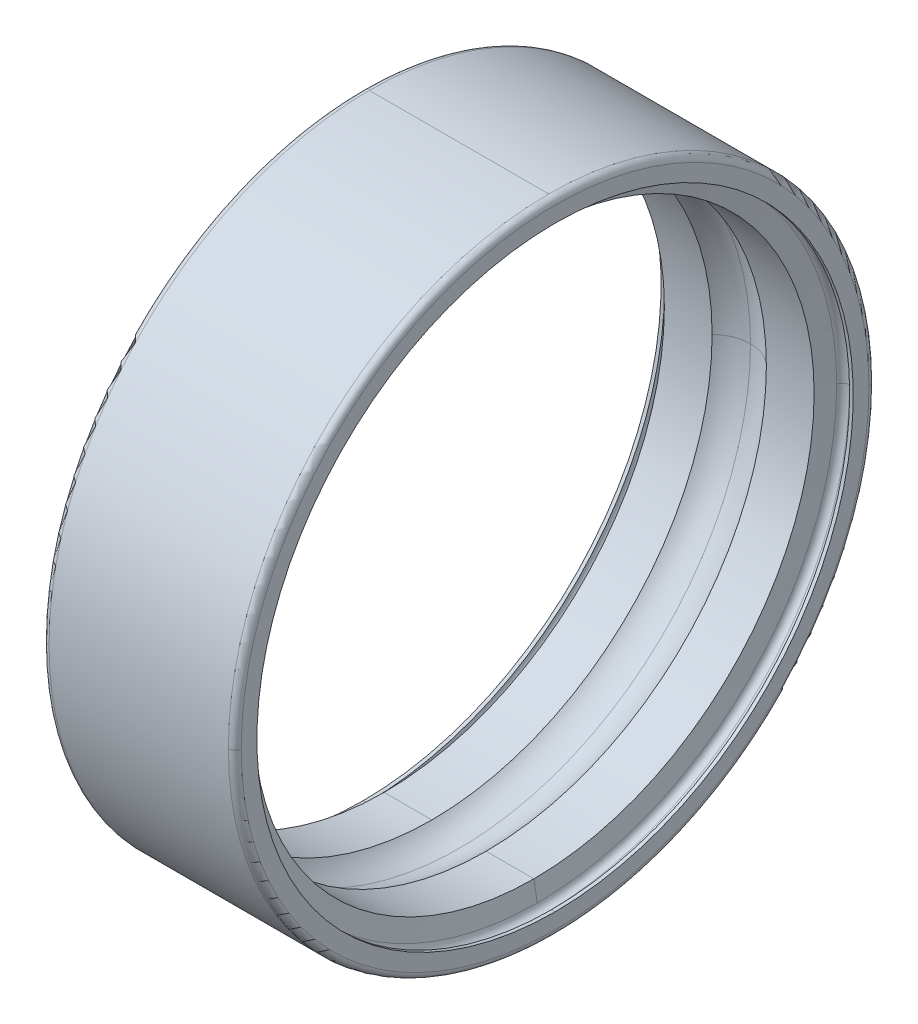
ISO-10303-21;
HEADER;
FILE_DESCRIPTION(('STEP AP214'),'2;1');
FILE_NAME('part.step','',(''),(''),'','','');
FILE_SCHEMA(('AUTOMOTIVE_DESIGN { 1 0 10303 214 1 1 1 1 }'));
ENDSEC;
DATA;
#1=APPLICATION_CONTEXT('core data for automotive mechanical design processes');
#2=APPLICATION_PROTOCOL_DEFINITION('international standard','automotive_design',2000,#1);
#3=PRODUCT_CONTEXT('',#1,'mechanical');
#4=PRODUCT('Part','Part','',(#3));
#5=PRODUCT_RELATED_PRODUCT_CATEGORY('part','',(#4));
#6=PRODUCT_DEFINITION_FORMATION('','',#4);
#7=PRODUCT_DEFINITION_CONTEXT('part definition',#1,'design');
#8=PRODUCT_DEFINITION('design','',#6,#7);
#9=PRODUCT_DEFINITION_SHAPE('','',#8);
#10=(LENGTH_UNIT() NAMED_UNIT(*) SI_UNIT(.MILLI.,.METRE.));
#11=(NAMED_UNIT(*) PLANE_ANGLE_UNIT() SI_UNIT($,.RADIAN.));
#12=(NAMED_UNIT(*) SI_UNIT($,.STERADIAN.) SOLID_ANGLE_UNIT());
#13=UNCERTAINTY_MEASURE_WITH_UNIT(LENGTH_MEASURE(1.E-05),#10,'distance_accuracy_value','');
#14=(GEOMETRIC_REPRESENTATION_CONTEXT(3) GLOBAL_UNCERTAINTY_ASSIGNED_CONTEXT((#13)) GLOBAL_UNIT_ASSIGNED_CONTEXT((#10,
#11,#12)) REPRESENTATION_CONTEXT('',''));
#15=CARTESIAN_POINT('',(0.,0.,0.));
#16=DIRECTION('',(0.,0.,1.));
#17=DIRECTION('',(1.,0.,0.));
#18=AXIS2_PLACEMENT_3D('',#15,#16,#17);
#19=CARTESIAN_POINT('',(2.832,0.,0.));
#20=DIRECTION('',(1.,0.,0.));
#21=DIRECTION('',(0.,0.,-1.));
#22=AXIS2_PLACEMENT_3D('',#19,#20,#21);
#23=TOROIDAL_SURFACE('',#22,4.655,0.112);
#24=CARTESIAN_POINT('',(2.832,0.,0.));
#25=DIRECTION('',(1.,0.,0.));
#26=DIRECTION('',(0.,0.,1.));
#27=AXIS2_PLACEMENT_3D('',#24,#25,#26);
#28=CIRCLE('',#27,4.767);
#29=CARTESIAN_POINT('',(2.832,0.,-4.767));
#30=VERTEX_POINT('',#29);
#31=CARTESIAN_POINT('',(2.832,0.,4.767));
#32=VERTEX_POINT('',#31);
#33=EDGE_CURVE('E392',#30,#32,#28,.T.);
#34=ORIENTED_EDGE('',*,*,#33,.T.);
#35=CARTESIAN_POINT('',(2.832,0.,4.655));
#36=DIRECTION('',(0.,-1.,0.));
#37=DIRECTION('',(0.,0.,1.));
#38=AXIS2_PLACEMENT_3D('',#35,#36,#37);
#39=CIRCLE('',#38,0.112);
#40=CARTESIAN_POINT('',(2.72170153166263,0.,4.6744485958987));
#41=VERTEX_POINT('',#40);
#42=EDGE_CURVE('E284',#32,#41,#39,.T.);
#43=ORIENTED_EDGE('',*,*,#42,.T.);
#44=CARTESIAN_POINT('',(2.72170153166263,0.,0.));
#45=DIRECTION('',(1.,0.,0.));
#46=DIRECTION('',(0.,1.,0.));
#47=AXIS2_PLACEMENT_3D('',#44,#45,#46);
#48=CIRCLE('',#47,4.6744485958987);
#49=CARTESIAN_POINT('',(2.72170153166263,4.6744485958987,0.));
#50=VERTEX_POINT('',#49);
#51=EDGE_CURVE('E31',#50,#41,#48,.T.);
#52=ORIENTED_EDGE('',*,*,#51,.F.);
#53=CARTESIAN_POINT('',(2.72170153166263,0.,0.));
#54=DIRECTION('',(1.,0.,0.));
#55=DIRECTION('',(0.,1.,0.));
#56=AXIS2_PLACEMENT_3D('',#53,#54,#55);
#57=CIRCLE('',#56,4.6744485958987);
#58=CARTESIAN_POINT('',(2.72170153166263,0.,-4.6744485958987));
#59=VERTEX_POINT('',#58);
#60=EDGE_CURVE('E221',#59,#50,#57,.T.);
#61=ORIENTED_EDGE('',*,*,#60,.F.);
#62=CARTESIAN_POINT('',(2.832,0.,-4.655));
#63=DIRECTION('',(0.,-1.,0.));
#64=DIRECTION('',(0.,0.,-1.));
#65=AXIS2_PLACEMENT_3D('',#62,#63,#64);
#66=CIRCLE('',#65,0.112);
#67=EDGE_CURVE('E274',#59,#30,#66,.T.);
#68=ORIENTED_EDGE('',*,*,#67,.T.);
#69=EDGE_LOOP('',(#34,#43,#52,#61,#68));
#70=FACE_BOUND('',#69,.T.);
#71=ADVANCED_FACE('F16',(#70),#23,.F.);
#72=CARTESIAN_POINT('',(2.972,0.,0.));
#73=DIRECTION('',(1.,0.,0.));
#74=DIRECTION('',(0.,1.,0.));
#75=AXIS2_PLACEMENT_3D('',#72,#73,#74);
#76=CYLINDRICAL_SURFACE('',#75,4.655);
#77=DIRECTION('',(1.,0.,0.));
#78=VECTOR('',#77,1.);
#79=CARTESIAN_POINT('',(2.972,4.655,0.));
#80=LINE('',#79,#78);
#81=CARTESIAN_POINT('',(2.944,4.655,0.));
#82=VERTEX_POINT('',#81);
#83=CARTESIAN_POINT('',(3.,4.655,0.));
#84=VERTEX_POINT('',#83);
#85=EDGE_CURVE('E286',#82,#84,#80,.T.);
#86=ORIENTED_EDGE('',*,*,#85,.T.);
#87=CARTESIAN_POINT('',(3.,0.,0.));
#88=DIRECTION('',(1.,0.,0.));
#89=DIRECTION('',(0.,1.,0.));
#90=AXIS2_PLACEMENT_3D('',#87,#88,#89);
#91=CIRCLE('',#90,4.655);
#92=CARTESIAN_POINT('',(3.,-4.655,0.));
#93=VERTEX_POINT('',#92);
#94=EDGE_CURVE('E11',#84,#93,#91,.T.);
#95=ORIENTED_EDGE('',*,*,#94,.T.);
#96=DIRECTION('',(-1.,0.,0.));
#97=VECTOR('',#96,1.);
#98=CARTESIAN_POINT('',(2.972,-4.655,0.));
#99=LINE('',#98,#97);
#100=CARTESIAN_POINT('',(2.944,-4.655,0.));
#101=VERTEX_POINT('',#100);
#102=EDGE_CURVE('E294',#93,#101,#99,.T.);
#103=ORIENTED_EDGE('',*,*,#102,.T.);
#104=CARTESIAN_POINT('',(2.944,0.,0.));
#105=DIRECTION('',(1.,0.,0.));
#106=DIRECTION('',(0.,1.,0.));
#107=AXIS2_PLACEMENT_3D('',#104,#105,#106);
#108=CIRCLE('',#107,4.655);
#109=CARTESIAN_POINT('',(2.944,0.,4.655));
#110=VERTEX_POINT('',#109);
#111=EDGE_CURVE('E263',#110,#101,#108,.T.);
#112=ORIENTED_EDGE('',*,*,#111,.F.);
#113=CARTESIAN_POINT('',(2.944,0.,0.));
#114=DIRECTION('',(1.,0.,0.));
#115=DIRECTION('',(0.,1.,0.));
#116=AXIS2_PLACEMENT_3D('',#113,#114,#115);
#117=CIRCLE('',#116,4.655);
#118=EDGE_CURVE('E401',#82,#110,#117,.T.);
#119=ORIENTED_EDGE('',*,*,#118,.F.);
#120=EDGE_LOOP('',(#86,#95,#103,#112,#119));
#121=FACE_BOUND('',#120,.T.);
#122=ADVANCED_FACE('F429',(#121),#76,.F.);
#123=CARTESIAN_POINT('',(3.,4.7775,0.));
#124=DIRECTION('',(1.,0.,0.));
#125=DIRECTION('',(0.,1.,0.));
#126=AXIS2_PLACEMENT_3D('',#123,#124,#125);
#127=PLANE('',#126);
#128=ORIENTED_EDGE('',*,*,#94,.F.);
#129=CARTESIAN_POINT('',(3.,0.,0.));
#130=DIRECTION('',(1.,0.,0.));
#131=DIRECTION('',(0.,1.,0.));
#132=AXIS2_PLACEMENT_3D('',#129,#130,#131);
#133=CIRCLE('',#132,4.655);
#134=EDGE_CURVE('E299',#93,#84,#133,.T.);
#135=ORIENTED_EDGE('',*,*,#134,.F.);
#136=EDGE_LOOP('',(#128,#135));
#137=FACE_BOUND('',#136,.T.);
#138=CARTESIAN_POINT('',(3.,0.,0.));
#139=DIRECTION('',(1.,0.,0.));
#140=DIRECTION('',(0.,1.,0.));
#141=AXIS2_PLACEMENT_3D('',#138,#139,#140);
#142=CIRCLE('',#141,4.9);
#143=CARTESIAN_POINT('',(3.,0.,4.9));
#144=VERTEX_POINT('',#143);
#145=CARTESIAN_POINT('',(3.,0.,-4.9));
#146=VERTEX_POINT('',#145);
#147=EDGE_CURVE('E19',#144,#146,#142,.T.);
#148=ORIENTED_EDGE('',*,*,#147,.T.);
#149=CARTESIAN_POINT('',(3.,0.,0.));
#150=DIRECTION('',(1.,0.,0.));
#151=DIRECTION('',(0.,1.,0.));
#152=AXIS2_PLACEMENT_3D('',#149,#150,#151);
#153=CIRCLE('',#152,4.9);
#154=EDGE_CURVE('E314',#146,#144,#153,.T.);
#155=ORIENTED_EDGE('',*,*,#154,.T.);
#156=EDGE_LOOP('',(#148,#155));
#157=FACE_BOUND('',#156,.T.);
#158=ADVANCED_FACE('F432',(#137,#157),#127,.T.);
#159=CARTESIAN_POINT('',(2.9,0.,0.));
#160=DIRECTION('',(1.,0.,0.));
#161=DIRECTION('',(0.,0.,-1.));
#162=AXIS2_PLACEMENT_3D('',#159,#160,#161);
#163=TOROIDAL_SURFACE('',#162,4.9,0.1);
#164=CARTESIAN_POINT('',(2.9,0.,-4.9));
#165=DIRECTION('',(0.,-1.,0.));
#166=DIRECTION('',(0.,0.,-1.));
#167=AXIS2_PLACEMENT_3D('',#164,#165,#166);
#168=CIRCLE('',#167,0.1);
#169=CARTESIAN_POINT('',(2.9,0.,-5.));
#170=VERTEX_POINT('',#169);
#171=EDGE_CURVE('E302',#170,#146,#168,.T.);
#172=ORIENTED_EDGE('',*,*,#171,.T.);
#173=ORIENTED_EDGE('',*,*,#147,.F.);
#174=CARTESIAN_POINT('',(2.9,0.,4.9));
#175=DIRECTION('',(0.,-1.,0.));
#176=DIRECTION('',(0.,0.,1.));
#177=AXIS2_PLACEMENT_3D('',#174,#175,#176);
#178=CIRCLE('',#177,0.1);
#179=CARTESIAN_POINT('',(2.9,0.,5.));
#180=VERTEX_POINT('',#179);
#181=EDGE_CURVE('E311',#144,#180,#178,.T.);
#182=ORIENTED_EDGE('',*,*,#181,.T.);
#183=CARTESIAN_POINT('',(2.9,0.,0.));
#184=DIRECTION('',(1.,0.,0.));
#185=DIRECTION('',(0.,1.,0.));
#186=AXIS2_PLACEMENT_3D('',#183,#184,#185);
#187=CIRCLE('',#186,5.);
#188=CARTESIAN_POINT('',(2.9,-5.,0.));
#189=VERTEX_POINT('',#188);
#190=EDGE_CURVE('E328',#180,#189,#187,.T.);
#191=ORIENTED_EDGE('',*,*,#190,.T.);
#192=CARTESIAN_POINT('',(2.9,0.,0.));
#193=DIRECTION('',(1.,0.,0.));
#194=DIRECTION('',(0.,1.,0.));
#195=AXIS2_PLACEMENT_3D('',#192,#193,#194);
#196=CIRCLE('',#195,5.);
#197=EDGE_CURVE('E244',#189,#170,#196,.T.);
#198=ORIENTED_EDGE('',*,*,#197,.T.);
#199=EDGE_LOOP('',(#172,#173,#182,#191,#198));
#200=FACE_BOUND('',#199,.T.);
#201=ADVANCED_FACE('F435',(#200),#163,.T.);
#202=CARTESIAN_POINT('',(1.5,0.,0.));
#203=DIRECTION('',(1.,0.,0.));
#204=DIRECTION('',(0.,1.,0.));
#205=AXIS2_PLACEMENT_3D('',#202,#203,#204);
#206=CYLINDRICAL_SURFACE('',#205,5.);
#207=DIRECTION('',(1.,0.,0.));
#208=VECTOR('',#207,1.);
#209=CARTESIAN_POINT('',(1.5,5.,0.));
#210=LINE('',#209,#208);
#211=CARTESIAN_POINT('',(0.1,5.,0.));
#212=VERTEX_POINT('',#211);
#213=CARTESIAN_POINT('',(2.9,5.,0.));
#214=VERTEX_POINT('',#213);
#215=EDGE_CURVE('E317',#212,#214,#210,.T.);
#216=ORIENTED_EDGE('',*,*,#215,.T.);
#217=CARTESIAN_POINT('',(2.9,0.,0.));
#218=DIRECTION('',(1.,0.,0.));
#219=DIRECTION('',(0.,1.,0.));
#220=AXIS2_PLACEMENT_3D('',#217,#218,#219);
#221=CIRCLE('',#220,5.);
#222=EDGE_CURVE('E305',#170,#214,#221,.T.);
#223=ORIENTED_EDGE('',*,*,#222,.F.);
#224=ORIENTED_EDGE('',*,*,#197,.F.);
#225=DIRECTION('',(-1.,0.,0.));
#226=VECTOR('',#225,1.);
#227=CARTESIAN_POINT('',(1.5,-5.,0.));
#228=LINE('',#227,#226);
#229=CARTESIAN_POINT('',(0.1,-5.,0.));
#230=VERTEX_POINT('',#229);
#231=EDGE_CURVE('E325',#189,#230,#228,.T.);
#232=ORIENTED_EDGE('',*,*,#231,.T.);
#233=CARTESIAN_POINT('',(0.1,0.,0.));
#234=DIRECTION('',(1.,0.,0.));
#235=DIRECTION('',(0.,1.,0.));
#236=AXIS2_PLACEMENT_3D('',#233,#234,#235);
#237=CIRCLE('',#236,5.);
#238=CARTESIAN_POINT('',(0.1,0.,-5.));
#239=VERTEX_POINT('',#238);
#240=EDGE_CURVE('E246',#230,#239,#237,.T.);
#241=ORIENTED_EDGE('',*,*,#240,.T.);
#242=CARTESIAN_POINT('',(0.1,0.,0.));
#243=DIRECTION('',(1.,0.,0.));
#244=DIRECTION('',(0.,1.,0.));
#245=AXIS2_PLACEMENT_3D('',#242,#243,#244);
#246=CIRCLE('',#245,5.);
#247=EDGE_CURVE('E338',#239,#212,#246,.T.);
#248=ORIENTED_EDGE('',*,*,#247,.T.);
#249=EDGE_LOOP('',(#216,#223,#224,#232,#241,#248));
#250=FACE_BOUND('',#249,.T.);
#251=ADVANCED_FACE('F445',(#250),#206,.T.);
#252=CARTESIAN_POINT('',(0.1,0.,0.));
#253=DIRECTION('',(1.,0.,0.));
#254=DIRECTION('',(0.,0.,-1.));
#255=AXIS2_PLACEMENT_3D('',#252,#253,#254);
#256=TOROIDAL_SURFACE('',#255,4.9,0.1);
#257=CARTESIAN_POINT('',(0.1,0.,-4.9));
#258=DIRECTION('',(0.,-1.,0.));
#259=DIRECTION('',(0.,0.,-1.));
#260=AXIS2_PLACEMENT_3D('',#257,#258,#259);
#261=CIRCLE('',#260,0.1);
#262=CARTESIAN_POINT('',(0.,0.,-4.9));
#263=VERTEX_POINT('',#262);
#264=EDGE_CURVE('E331',#263,#239,#261,.T.);
#265=ORIENTED_EDGE('',*,*,#264,.T.);
#266=ORIENTED_EDGE('',*,*,#240,.F.);
#267=CARTESIAN_POINT('',(0.1,0.,0.));
#268=DIRECTION('',(1.,0.,0.));
#269=DIRECTION('',(0.,1.,0.));
#270=AXIS2_PLACEMENT_3D('',#267,#268,#269);
#271=CIRCLE('',#270,5.);
#272=CARTESIAN_POINT('',(0.1,0.,5.));
#273=VERTEX_POINT('',#272);
#274=EDGE_CURVE('E322',#273,#230,#271,.T.);
#275=ORIENTED_EDGE('',*,*,#274,.F.);
#276=CARTESIAN_POINT('',(0.1,0.,4.9));
#277=DIRECTION('',(0.,-1.,0.));
#278=DIRECTION('',(0.,0.,1.));
#279=AXIS2_PLACEMENT_3D('',#276,#277,#278);
#280=CIRCLE('',#279,0.1);
#281=CARTESIAN_POINT('',(0.,0.,4.9));
#282=VERTEX_POINT('',#281);
#283=EDGE_CURVE('E335',#273,#282,#280,.T.);
#284=ORIENTED_EDGE('',*,*,#283,.T.);
#285=CARTESIAN_POINT('',(0.,0.,0.));
#286=DIRECTION('',(1.,0.,0.));
#287=DIRECTION('',(0.,1.,0.));
#288=AXIS2_PLACEMENT_3D('',#285,#286,#287);
#289=CIRCLE('',#288,4.9);
#290=EDGE_CURVE('E260',#282,#263,#289,.T.);
#291=ORIENTED_EDGE('',*,*,#290,.T.);
#292=EDGE_LOOP('',(#265,#266,#275,#284,#291));
#293=FACE_BOUND('',#292,.T.);
#294=ADVANCED_FACE('F381',(#293),#256,.T.);
#295=CARTESIAN_POINT('',(0.,4.7775,0.));
#296=DIRECTION('',(-1.,0.,0.));
#297=DIRECTION('',(0.,0.,1.));
#298=AXIS2_PLACEMENT_3D('',#295,#296,#297);
#299=PLANE('',#298);
#300=CARTESIAN_POINT('',(0.,0.,0.));
#301=DIRECTION('',(1.,0.,0.));
#302=DIRECTION('',(0.,1.,0.));
#303=AXIS2_PLACEMENT_3D('',#300,#301,#302);
#304=CIRCLE('',#303,4.655);
#305=CARTESIAN_POINT('',(0.,4.655,0.));
#306=VERTEX_POINT('',#305);
#307=CARTESIAN_POINT('',(0.,-4.655,0.));
#308=VERTEX_POINT('',#307);
#309=EDGE_CURVE('E377',#306,#308,#304,.T.);
#310=ORIENTED_EDGE('',*,*,#309,.T.);
#311=CARTESIAN_POINT('',(0.,0.,0.));
#312=DIRECTION('',(1.,0.,0.));
#313=DIRECTION('',(0.,1.,0.));
#314=AXIS2_PLACEMENT_3D('',#311,#312,#313);
#315=CIRCLE('',#314,4.655);
#316=EDGE_CURVE('E235',#308,#306,#315,.T.);
#317=ORIENTED_EDGE('',*,*,#316,.T.);
#318=EDGE_LOOP('',(#310,#317));
#319=FACE_BOUND('',#318,.T.);
#320=CARTESIAN_POINT('',(0.,0.,0.));
#321=DIRECTION('',(1.,0.,0.));
#322=DIRECTION('',(0.,1.,0.));
#323=AXIS2_PLACEMENT_3D('',#320,#321,#322);
#324=CIRCLE('',#323,4.9);
#325=EDGE_CURVE('E332',#263,#282,#324,.T.);
#326=ORIENTED_EDGE('',*,*,#325,.F.);
#327=ORIENTED_EDGE('',*,*,#290,.F.);
#328=EDGE_LOOP('',(#326,#327));
#329=FACE_BOUND('',#328,.T.);
#330=ADVANCED_FACE('F385',(#319,#329),#299,.T.);
#331=CARTESIAN_POINT('',(0.028,0.,0.));
#332=DIRECTION('',(1.,0.,0.));
#333=DIRECTION('',(0.,1.,0.));
#334=AXIS2_PLACEMENT_3D('',#331,#332,#333);
#335=CYLINDRICAL_SURFACE('',#334,4.655);
#336=DIRECTION('',(1.,0.,0.));
#337=VECTOR('',#336,1.);
#338=CARTESIAN_POINT('',(0.028,4.655,0.));
#339=LINE('',#338,#337);
#340=CARTESIAN_POINT('',(0.056,4.655,0.));
#341=VERTEX_POINT('',#340);
#342=EDGE_CURVE('E239',#306,#341,#339,.T.);
#343=ORIENTED_EDGE('',*,*,#342,.T.);
#344=CARTESIAN_POINT('',(0.056,0.,0.));
#345=DIRECTION('',(1.,0.,0.));
#346=DIRECTION('',(0.,1.,0.));
#347=AXIS2_PLACEMENT_3D('',#344,#345,#346);
#348=CIRCLE('',#347,4.655);
#349=CARTESIAN_POINT('',(0.056,0.,4.655));
#350=VERTEX_POINT('',#349);
#351=EDGE_CURVE('E375',#341,#350,#348,.T.);
#352=ORIENTED_EDGE('',*,*,#351,.T.);
#353=CARTESIAN_POINT('',(0.056,0.,0.));
#354=DIRECTION('',(1.,0.,0.));
#355=DIRECTION('',(0.,1.,0.));
#356=AXIS2_PLACEMENT_3D('',#353,#354,#355);
#357=CIRCLE('',#356,4.655);
#358=CARTESIAN_POINT('',(0.056,-4.655,0.));
#359=VERTEX_POINT('',#358);
#360=EDGE_CURVE('E267',#350,#359,#357,.T.);
#361=ORIENTED_EDGE('',*,*,#360,.T.);
#362=DIRECTION('',(-1.,0.,0.));
#363=VECTOR('',#362,1.);
#364=CARTESIAN_POINT('',(0.028,-4.655,0.));
#365=LINE('',#364,#363);
#366=EDGE_CURVE('E238',#359,#308,#365,.T.);
#367=ORIENTED_EDGE('',*,*,#366,.T.);
#368=ORIENTED_EDGE('',*,*,#309,.F.);
#369=EDGE_LOOP('',(#343,#352,#361,#367,#368));
#370=FACE_BOUND('',#369,.T.);
#371=ADVANCED_FACE('F537',(#370),#335,.F.);
#372=CARTESIAN_POINT('',(0.168,0.,0.));
#373=DIRECTION('',(1.,0.,0.));
#374=DIRECTION('',(0.,0.,-1.));
#375=AXIS2_PLACEMENT_3D('',#372,#373,#374);
#376=TOROIDAL_SURFACE('',#375,4.655,0.112);
#377=CARTESIAN_POINT('',(0.168,0.,0.));
#378=DIRECTION('',(1.,0.,0.));
#379=DIRECTION('',(0.,0.,1.));
#380=AXIS2_PLACEMENT_3D('',#377,#378,#379);
#381=CIRCLE('',#380,4.767);
#382=CARTESIAN_POINT('',(0.168,0.,-4.767));
#383=VERTEX_POINT('',#382);
#384=CARTESIAN_POINT('',(0.168,0.,4.767));
#385=VERTEX_POINT('',#384);
#386=EDGE_CURVE('E210',#383,#385,#381,.T.);
#387=ORIENTED_EDGE('',*,*,#386,.T.);
#388=CARTESIAN_POINT('',(0.168,0.,4.655));
#389=DIRECTION('',(0.,-1.,0.));
#390=DIRECTION('',(0.,0.,1.));
#391=AXIS2_PLACEMENT_3D('',#388,#389,#390);
#392=CIRCLE('',#391,0.112);
#393=EDGE_CURVE('E264',#385,#350,#392,.T.);
#394=ORIENTED_EDGE('',*,*,#393,.T.);
#395=ORIENTED_EDGE('',*,*,#351,.F.);
#396=CARTESIAN_POINT('',(0.056,0.,0.));
#397=DIRECTION('',(1.,0.,0.));
#398=DIRECTION('',(0.,1.,0.));
#399=AXIS2_PLACEMENT_3D('',#396,#397,#398);
#400=CIRCLE('',#399,4.655);
#401=CARTESIAN_POINT('',(0.056,0.,-4.655));
#402=VERTEX_POINT('',#401);
#403=EDGE_CURVE('E254',#402,#341,#400,.T.);
#404=ORIENTED_EDGE('',*,*,#403,.F.);
#405=CARTESIAN_POINT('',(0.168,0.,-4.655));
#406=DIRECTION('',(0.,-1.,0.));
#407=DIRECTION('',(0.,0.,-1.));
#408=AXIS2_PLACEMENT_3D('',#405,#406,#407);
#409=CIRCLE('',#408,0.112);
#410=EDGE_CURVE('E257',#402,#383,#409,.T.);
#411=ORIENTED_EDGE('',*,*,#410,.T.);
#412=EDGE_LOOP('',(#387,#394,#395,#404,#411));
#413=FACE_BOUND('',#412,.T.);
#414=ADVANCED_FACE('F533',(#413),#376,.F.);
#415=CARTESIAN_POINT('',(0.304698901733471,0.,0.));
#416=DIRECTION('',(-1.,0.,0.));
#417=DIRECTION('',(0.,1.,0.));
#418=AXIS2_PLACEMENT_3D('',#415,#416,#417);
#419=CONICAL_SURFACE('',#418,4.52472429794935,1.39626340159546);
#420=DIRECTION('',(0.173648177666931,-0.984807753012208,0.));
#421=VECTOR('',#420,1.);
#422=CARTESIAN_POINT('',(0.304698901733471,4.52472429794935,0.));
#423=LINE('',#422,#421);
#424=CARTESIAN_POINT('',(0.278298468337368,4.6744485958987,0.));
#425=VERTEX_POINT('',#424);
#426=CARTESIAN_POINT('',(0.331099335129574,4.375,0.));
#427=VERTEX_POINT('',#426);
#428=EDGE_CURVE('E201',#425,#427,#423,.T.);
#429=ORIENTED_EDGE('',*,*,#428,.T.);
#430=CARTESIAN_POINT('',(0.331099335129574,0.,0.));
#431=DIRECTION('',(1.,0.,0.));
#432=DIRECTION('',(0.,1.,0.));
#433=AXIS2_PLACEMENT_3D('',#430,#431,#432);
#434=CIRCLE('',#433,4.375);
#435=CARTESIAN_POINT('',(0.331099335129574,-4.375,0.));
#436=VERTEX_POINT('',#435);
#437=EDGE_CURVE('E373',#427,#436,#434,.T.);
#438=ORIENTED_EDGE('',*,*,#437,.T.);
#439=DIRECTION('',(-0.173648177666931,-0.984807753012208,0.));
#440=VECTOR('',#439,1.);
#441=CARTESIAN_POINT('',(0.304698901733471,-4.52472429794935,0.));
#442=LINE('',#441,#440);
#443=CARTESIAN_POINT('',(0.278298468337367,-4.6744485958987,0.));
#444=VERTEX_POINT('',#443);
#445=EDGE_CURVE('E271',#436,#444,#442,.T.);
#446=ORIENTED_EDGE('',*,*,#445,.T.);
#447=CARTESIAN_POINT('',(0.278298468337367,0.,0.));
#448=DIRECTION('',(1.,0.,0.));
#449=DIRECTION('',(0.,1.,0.));
#450=AXIS2_PLACEMENT_3D('',#447,#448,#449);
#451=CIRCLE('',#450,4.6744485958987);
#452=CARTESIAN_POINT('',(0.278298468337367,0.,4.6744485958987));
#453=VERTEX_POINT('',#452);
#454=EDGE_CURVE('E191',#453,#444,#451,.T.);
#455=ORIENTED_EDGE('',*,*,#454,.F.);
#456=CARTESIAN_POINT('',(0.278298468337367,0.,0.));
#457=DIRECTION('',(1.,0.,0.));
#458=DIRECTION('',(0.,1.,0.));
#459=AXIS2_PLACEMENT_3D('',#456,#457,#458);
#460=CIRCLE('',#459,4.6744485958987);
#461=EDGE_CURVE('E205',#425,#453,#460,.T.);
#462=ORIENTED_EDGE('',*,*,#461,.F.);
#463=EDGE_LOOP('',(#429,#438,#446,#455,#462));
#464=FACE_BOUND('',#463,.T.);
#465=ADVANCED_FACE('F529',(#464),#419,.F.);
#466=CARTESIAN_POINT('',(0.70378623823857,0.,0.));
#467=DIRECTION('',(1.,0.,0.));
#468=DIRECTION('',(0.,1.,0.));
#469=AXIS2_PLACEMENT_3D('',#466,#467,#468);
#470=CYLINDRICAL_SURFACE('',#469,4.375);
#471=DIRECTION('',(1.,0.,0.));
#472=VECTOR('',#471,1.);
#473=CARTESIAN_POINT('',(0.70378623823857,4.375,0.));
#474=LINE('',#473,#472);
#475=CARTESIAN_POINT('',(1.07647314134757,4.375,0.));
#476=VERTEX_POINT('',#475);
#477=EDGE_CURVE('E278',#427,#476,#474,.T.);
#478=ORIENTED_EDGE('',*,*,#477,.T.);
#479=CARTESIAN_POINT('',(1.07647314134757,0.,0.));
#480=DIRECTION('',(1.,0.,0.));
#481=DIRECTION('',(0.,1.,0.));
#482=AXIS2_PLACEMENT_3D('',#479,#480,#481);
#483=CIRCLE('',#482,4.375);
#484=CARTESIAN_POINT('',(1.07647314134757,0.,4.375));
#485=VERTEX_POINT('',#484);
#486=EDGE_CURVE('E371',#476,#485,#483,.T.);
#487=ORIENTED_EDGE('',*,*,#486,.T.);
#488=CARTESIAN_POINT('',(1.07647314134757,0.,0.));
#489=DIRECTION('',(1.,0.,0.));
#490=DIRECTION('',(0.,1.,0.));
#491=AXIS2_PLACEMENT_3D('',#488,#489,#490);
#492=CIRCLE('',#491,4.375);
#493=CARTESIAN_POINT('',(1.07647314134757,-4.375,0.));
#494=VERTEX_POINT('',#493);
#495=EDGE_CURVE('E354',#485,#494,#492,.T.);
#496=ORIENTED_EDGE('',*,*,#495,.T.);
#497=DIRECTION('',(-1.,0.,0.));
#498=VECTOR('',#497,1.);
#499=CARTESIAN_POINT('',(0.70378623823857,-4.375,0.));
#500=LINE('',#499,#498);
#501=EDGE_CURVE('E291',#494,#436,#500,.T.);
#502=ORIENTED_EDGE('',*,*,#501,.T.);
#503=ORIENTED_EDGE('',*,*,#437,.F.);
#504=EDGE_LOOP('',(#478,#487,#496,#502,#503));
#505=FACE_BOUND('',#504,.T.);
#506=ADVANCED_FACE('F525',(#505),#470,.F.);
#507=CARTESIAN_POINT('',(1.5,0.,0.));
#508=DIRECTION('',(1.,0.,0.));
#509=DIRECTION('',(0.,0.,-1.));
#510=AXIS2_PLACEMENT_3D('',#507,#508,#509);
#511=TOROIDAL_SURFACE('',#510,3.95,0.6);
#512=CARTESIAN_POINT('',(1.5,0.,0.));
#513=DIRECTION('',(1.,0.,0.));
#514=DIRECTION('',(0.,0.,1.));
#515=AXIS2_PLACEMENT_3D('',#512,#513,#514);
#516=CIRCLE('',#515,4.55);
#517=CARTESIAN_POINT('',(1.5,0.,-4.55));
#518=VERTEX_POINT('',#517);
#519=CARTESIAN_POINT('',(1.5,0.,4.55));
#520=VERTEX_POINT('',#519);
#521=EDGE_CURVE('E219',#518,#520,#516,.T.);
#522=ORIENTED_EDGE('',*,*,#521,.T.);
#523=CARTESIAN_POINT('',(1.5,0.,3.95));
#524=DIRECTION('',(0.,-1.,0.));
#525=DIRECTION('',(0.,0.,1.));
#526=AXIS2_PLACEMENT_3D('',#523,#524,#525);
#527=CIRCLE('',#526,0.6);
#528=EDGE_CURVE('E356',#520,#485,#527,.T.);
#529=ORIENTED_EDGE('',*,*,#528,.T.);
#530=ORIENTED_EDGE('',*,*,#486,.F.);
#531=CARTESIAN_POINT('',(1.07647314134757,0.,0.));
#532=DIRECTION('',(1.,0.,0.));
#533=DIRECTION('',(0.,1.,0.));
#534=AXIS2_PLACEMENT_3D('',#531,#532,#533);
#535=CIRCLE('',#534,4.375);
#536=CARTESIAN_POINT('',(1.07647314134757,0.,-4.375));
#537=VERTEX_POINT('',#536);
#538=EDGE_CURVE('E290',#537,#476,#535,.T.);
#539=ORIENTED_EDGE('',*,*,#538,.F.);
#540=CARTESIAN_POINT('',(1.5,0.,-3.95));
#541=DIRECTION('',(0.,-1.,0.));
#542=DIRECTION('',(0.,0.,-1.));
#543=AXIS2_PLACEMENT_3D('',#540,#541,#542);
#544=CIRCLE('',#543,0.6);
#545=EDGE_CURVE('E297',#537,#518,#544,.T.);
#546=ORIENTED_EDGE('',*,*,#545,.T.);
#547=EDGE_LOOP('',(#522,#529,#530,#539,#546));
#548=FACE_BOUND('',#547,.T.);
#549=ADVANCED_FACE('F522',(#548),#511,.F.);
#550=CARTESIAN_POINT('',(2.29621376176143,0.,0.));
#551=DIRECTION('',(1.,0.,0.));
#552=DIRECTION('',(0.,1.,0.));
#553=AXIS2_PLACEMENT_3D('',#550,#551,#552);
#554=CYLINDRICAL_SURFACE('',#553,4.375);
#555=DIRECTION('',(1.,0.,0.));
#556=VECTOR('',#555,1.);
#557=CARTESIAN_POINT('',(2.29621376176143,4.375,0.));
#558=LINE('',#557,#556);
#559=CARTESIAN_POINT('',(1.92352685865243,4.375,0.));
#560=VERTEX_POINT('',#559);
#561=CARTESIAN_POINT('',(2.66890066487043,4.375,0.));
#562=VERTEX_POINT('',#561);
#563=EDGE_CURVE('E359',#560,#562,#558,.T.);
#564=ORIENTED_EDGE('',*,*,#563,.T.);
#565=CARTESIAN_POINT('',(2.66890066487043,0.,0.));
#566=DIRECTION('',(1.,0.,0.));
#567=DIRECTION('',(0.,1.,0.));
#568=AXIS2_PLACEMENT_3D('',#565,#566,#567);
#569=CIRCLE('',#568,4.375);
#570=CARTESIAN_POINT('',(2.66890066487043,-4.375,0.));
#571=VERTEX_POINT('',#570);
#572=EDGE_CURVE('E39',#562,#571,#569,.T.);
#573=ORIENTED_EDGE('',*,*,#572,.T.);
#574=DIRECTION('',(-1.,0.,0.));
#575=VECTOR('',#574,1.);
#576=CARTESIAN_POINT('',(2.29621376176143,-4.375,0.));
#577=LINE('',#576,#575);
#578=CARTESIAN_POINT('',(1.92352685865244,-4.375,0.));
#579=VERTEX_POINT('',#578);
#580=EDGE_CURVE('E361',#571,#579,#577,.T.);
#581=ORIENTED_EDGE('',*,*,#580,.T.);
#582=CARTESIAN_POINT('',(1.92352685865243,0.,0.));
#583=DIRECTION('',(1.,0.,0.));
#584=DIRECTION('',(0.,1.,0.));
#585=AXIS2_PLACEMENT_3D('',#582,#583,#584);
#586=CIRCLE('',#585,4.375);
#587=CARTESIAN_POINT('',(1.92352685865243,0.,4.375));
#588=VERTEX_POINT('',#587);
#589=EDGE_CURVE('E240',#588,#579,#586,.T.);
#590=ORIENTED_EDGE('',*,*,#589,.F.);
#591=CARTESIAN_POINT('',(1.92352685865243,0.,0.));
#592=DIRECTION('',(1.,0.,0.));
#593=DIRECTION('',(0.,1.,0.));
#594=AXIS2_PLACEMENT_3D('',#591,#592,#593);
#595=CIRCLE('',#594,4.375);
#596=EDGE_CURVE('E228',#560,#588,#595,.T.);
#597=ORIENTED_EDGE('',*,*,#596,.F.);
#598=EDGE_LOOP('',(#564,#573,#581,#590,#597));
#599=FACE_BOUND('',#598,.T.);
#600=ADVANCED_FACE('F498',(#599),#554,.F.);
#601=CARTESIAN_POINT('',(2.69530109826653,0.,0.));
#602=DIRECTION('',(1.,0.,0.));
#603=DIRECTION('',(0.,1.,0.));
#604=AXIS2_PLACEMENT_3D('',#601,#602,#603);
#605=CONICAL_SURFACE('',#604,4.52472429794935,1.39626340159546);
#606=DIRECTION('',(0.17364817766693,0.984807753012208,0.));
#607=VECTOR('',#606,1.);
#608=CARTESIAN_POINT('',(2.69530109826653,4.52472429794935,0.));
#609=LINE('',#608,#607);
#610=EDGE_CURVE('E366',#562,#50,#609,.T.);
#611=ORIENTED_EDGE('',*,*,#610,.T.);
#612=ORIENTED_EDGE('',*,*,#51,.T.);
#613=CARTESIAN_POINT('',(2.72170153166263,0.,0.));
#614=DIRECTION('',(1.,0.,0.));
#615=DIRECTION('',(0.,1.,0.));
#616=AXIS2_PLACEMENT_3D('',#613,#614,#615);
#617=CIRCLE('',#616,4.6744485958987);
#618=CARTESIAN_POINT('',(2.72170153166263,-4.6744485958987,0.));
#619=VERTEX_POINT('',#618);
#620=EDGE_CURVE('E281',#41,#619,#617,.T.);
#621=ORIENTED_EDGE('',*,*,#620,.T.);
#622=DIRECTION('',(-0.17364817766693,0.984807753012208,0.));
#623=VECTOR('',#622,1.);
#624=CARTESIAN_POINT('',(2.69530109826653,-4.52472429794935,0.));
#625=LINE('',#624,#623);
#626=EDGE_CURVE('E346',#619,#571,#625,.T.);
#627=ORIENTED_EDGE('',*,*,#626,.T.);
#628=ORIENTED_EDGE('',*,*,#572,.F.);
#629=EDGE_LOOP('',(#611,#612,#621,#627,#628));
#630=FACE_BOUND('',#629,.T.);
#631=ADVANCED_FACE('F494',(#630),#605,.F.);
#632=CARTESIAN_POINT('',(2.69530109826653,0.,0.));
#633=DIRECTION('',(1.,0.,0.));
#634=DIRECTION('',(0.,1.,0.));
#635=AXIS2_PLACEMENT_3D('',#632,#633,#634);
#636=CONICAL_SURFACE('',#635,4.52472429794935,1.39626340159546);
#637=ORIENTED_EDGE('',*,*,#610,.F.);
#638=CARTESIAN_POINT('',(2.66890066487043,0.,0.));
#639=DIRECTION('',(1.,0.,0.));
#640=DIRECTION('',(0.,1.,0.));
#641=AXIS2_PLACEMENT_3D('',#638,#639,#640);
#642=CIRCLE('',#641,4.375);
#643=EDGE_CURVE('E363',#571,#562,#642,.T.);
#644=ORIENTED_EDGE('',*,*,#643,.F.);
#645=ORIENTED_EDGE('',*,*,#626,.F.);
#646=CARTESIAN_POINT('',(2.72170153166263,0.,0.));
#647=DIRECTION('',(1.,0.,0.));
#648=DIRECTION('',(0.,1.,0.));
#649=AXIS2_PLACEMENT_3D('',#646,#647,#648);
#650=CIRCLE('',#649,4.6744485958987);
#651=EDGE_CURVE('E275',#619,#59,#650,.T.);
#652=ORIENTED_EDGE('',*,*,#651,.T.);
#653=ORIENTED_EDGE('',*,*,#60,.T.);
#654=EDGE_LOOP('',(#637,#644,#645,#652,#653));
#655=FACE_BOUND('',#654,.T.);
#656=ADVANCED_FACE('F497',(#655),#636,.F.);
#657=CARTESIAN_POINT('',(2.29621376176143,0.,0.));
#658=DIRECTION('',(1.,0.,0.));
#659=DIRECTION('',(0.,1.,0.));
#660=AXIS2_PLACEMENT_3D('',#657,#658,#659);
#661=CYLINDRICAL_SURFACE('',#660,4.375);
#662=ORIENTED_EDGE('',*,*,#563,.F.);
#663=CARTESIAN_POINT('',(1.92352685865243,0.,0.));
#664=DIRECTION('',(1.,0.,0.));
#665=DIRECTION('',(0.,1.,0.));
#666=AXIS2_PLACEMENT_3D('',#663,#664,#665);
#667=CIRCLE('',#666,4.375);
#668=CARTESIAN_POINT('',(1.92352685865243,0.,-4.375));
#669=VERTEX_POINT('',#668);
#670=EDGE_CURVE('E225',#669,#560,#667,.T.);
#671=ORIENTED_EDGE('',*,*,#670,.F.);
#672=CARTESIAN_POINT('',(1.92352685865243,0.,0.));
#673=DIRECTION('',(1.,0.,0.));
#674=DIRECTION('',(0.,1.,0.));
#675=AXIS2_PLACEMENT_3D('',#672,#673,#674);
#676=CIRCLE('',#675,4.375);
#677=EDGE_CURVE('E243',#579,#669,#676,.T.);
#678=ORIENTED_EDGE('',*,*,#677,.F.);
#679=ORIENTED_EDGE('',*,*,#580,.F.);
#680=ORIENTED_EDGE('',*,*,#643,.T.);
#681=EDGE_LOOP('',(#662,#671,#678,#679,#680));
#682=FACE_BOUND('',#681,.T.);
#683=ADVANCED_FACE('F509',(#682),#661,.F.);
#684=CARTESIAN_POINT('',(1.5,0.,0.));
#685=DIRECTION('',(1.,0.,0.));
#686=DIRECTION('',(0.,0.,-1.));
#687=AXIS2_PLACEMENT_3D('',#684,#685,#686);
#688=TOROIDAL_SURFACE('',#687,3.95,0.6);
#689=CARTESIAN_POINT('',(1.5,0.,0.));
#690=DIRECTION('',(1.,0.,0.));
#691=DIRECTION('',(0.,0.,1.));
#692=AXIS2_PLACEMENT_3D('',#689,#690,#691);
#693=CIRCLE('',#692,4.55);
#694=EDGE_CURVE('E234',#520,#518,#693,.T.);
#695=ORIENTED_EDGE('',*,*,#694,.T.);
#696=ORIENTED_EDGE('',*,*,#545,.F.);
#697=CARTESIAN_POINT('',(1.07647314134757,0.,0.));
#698=DIRECTION('',(1.,0.,0.));
#699=DIRECTION('',(0.,1.,0.));
#700=AXIS2_PLACEMENT_3D('',#697,#698,#699);
#701=CIRCLE('',#700,4.375);
#702=EDGE_CURVE('E287',#494,#537,#701,.T.);
#703=ORIENTED_EDGE('',*,*,#702,.F.);
#704=ORIENTED_EDGE('',*,*,#495,.F.);
#705=ORIENTED_EDGE('',*,*,#528,.F.);
#706=EDGE_LOOP('',(#695,#696,#703,#704,#705));
#707=FACE_BOUND('',#706,.T.);
#708=ADVANCED_FACE('F504',(#707),#688,.F.);
#709=CARTESIAN_POINT('',(0.70378623823857,0.,0.));
#710=DIRECTION('',(1.,0.,0.));
#711=DIRECTION('',(0.,1.,0.));
#712=AXIS2_PLACEMENT_3D('',#709,#710,#711);
#713=CYLINDRICAL_SURFACE('',#712,4.375);
#714=ORIENTED_EDGE('',*,*,#477,.F.);
#715=CARTESIAN_POINT('',(0.331099335129574,0.,0.));
#716=DIRECTION('',(1.,0.,0.));
#717=DIRECTION('',(0.,1.,0.));
#718=AXIS2_PLACEMENT_3D('',#715,#716,#717);
#719=CIRCLE('',#718,4.375);
#720=EDGE_CURVE('E273',#436,#427,#719,.T.);
#721=ORIENTED_EDGE('',*,*,#720,.F.);
#722=ORIENTED_EDGE('',*,*,#501,.F.);
#723=ORIENTED_EDGE('',*,*,#702,.T.);
#724=ORIENTED_EDGE('',*,*,#538,.T.);
#725=EDGE_LOOP('',(#714,#721,#722,#723,#724));
#726=FACE_BOUND('',#725,.T.);
#727=ADVANCED_FACE('F482',(#726),#713,.F.);
#728=CARTESIAN_POINT('',(0.304698901733471,0.,0.));
#729=DIRECTION('',(-1.,0.,0.));
#730=DIRECTION('',(0.,1.,0.));
#731=AXIS2_PLACEMENT_3D('',#728,#729,#730);
#732=CONICAL_SURFACE('',#731,4.52472429794935,1.39626340159546);
#733=ORIENTED_EDGE('',*,*,#428,.F.);
#734=CARTESIAN_POINT('',(0.278298468337367,0.,0.));
#735=DIRECTION('',(1.,0.,0.));
#736=DIRECTION('',(0.,1.,0.));
#737=AXIS2_PLACEMENT_3D('',#734,#735,#736);
#738=CIRCLE('',#737,4.6744485958987);
#739=CARTESIAN_POINT('',(0.278298468337367,0.,-4.6744485958987));
#740=VERTEX_POINT('',#739);
#741=EDGE_CURVE('E197',#740,#425,#738,.T.);
#742=ORIENTED_EDGE('',*,*,#741,.F.);
#743=CARTESIAN_POINT('',(0.278298468337367,0.,0.));
#744=DIRECTION('',(1.,0.,0.));
#745=DIRECTION('',(0.,1.,0.));
#746=AXIS2_PLACEMENT_3D('',#743,#744,#745);
#747=CIRCLE('',#746,4.6744485958987);
#748=EDGE_CURVE('E183',#444,#740,#747,.T.);
#749=ORIENTED_EDGE('',*,*,#748,.F.);
#750=ORIENTED_EDGE('',*,*,#445,.F.);
#751=ORIENTED_EDGE('',*,*,#720,.T.);
#752=EDGE_LOOP('',(#733,#742,#749,#750,#751));
#753=FACE_BOUND('',#752,.T.);
#754=ADVANCED_FACE('F198',(#753),#732,.F.);
#755=CARTESIAN_POINT('',(0.168,0.,0.));
#756=DIRECTION('',(1.,0.,0.));
#757=DIRECTION('',(0.,0.,-1.));
#758=AXIS2_PLACEMENT_3D('',#755,#756,#757);
#759=TOROIDAL_SURFACE('',#758,4.655,0.112);
#760=CARTESIAN_POINT('',(0.168,0.,0.));
#761=DIRECTION('',(1.,0.,0.));
#762=DIRECTION('',(0.,0.,1.));
#763=AXIS2_PLACEMENT_3D('',#760,#761,#762);
#764=CIRCLE('',#763,4.767);
#765=EDGE_CURVE('E251',#385,#383,#764,.T.);
#766=ORIENTED_EDGE('',*,*,#765,.T.);
#767=ORIENTED_EDGE('',*,*,#410,.F.);
#768=CARTESIAN_POINT('',(0.056,0.,0.));
#769=DIRECTION('',(1.,0.,0.));
#770=DIRECTION('',(0.,1.,0.));
#771=AXIS2_PLACEMENT_3D('',#768,#769,#770);
#772=CIRCLE('',#771,4.655);
#773=EDGE_CURVE('E249',#359,#402,#772,.T.);
#774=ORIENTED_EDGE('',*,*,#773,.F.);
#775=ORIENTED_EDGE('',*,*,#360,.F.);
#776=ORIENTED_EDGE('',*,*,#393,.F.);
#777=EDGE_LOOP('',(#766,#767,#774,#775,#776));
#778=FACE_BOUND('',#777,.T.);
#779=ADVANCED_FACE('F481',(#778),#759,.F.);
#780=CARTESIAN_POINT('',(0.028,0.,0.));
#781=DIRECTION('',(1.,0.,0.));
#782=DIRECTION('',(0.,1.,0.));
#783=AXIS2_PLACEMENT_3D('',#780,#781,#782);
#784=CYLINDRICAL_SURFACE('',#783,4.655);
#785=ORIENTED_EDGE('',*,*,#342,.F.);
#786=ORIENTED_EDGE('',*,*,#316,.F.);
#787=ORIENTED_EDGE('',*,*,#366,.F.);
#788=ORIENTED_EDGE('',*,*,#773,.T.);
#789=ORIENTED_EDGE('',*,*,#403,.T.);
#790=EDGE_LOOP('',(#785,#786,#787,#788,#789));
#791=FACE_BOUND('',#790,.T.);
#792=ADVANCED_FACE('F458',(#791),#784,.F.);
#793=CARTESIAN_POINT('',(0.1,0.,0.));
#794=DIRECTION('',(1.,0.,0.));
#795=DIRECTION('',(0.,0.,-1.));
#796=AXIS2_PLACEMENT_3D('',#793,#794,#795);
#797=TOROIDAL_SURFACE('',#796,4.9,0.1);
#798=ORIENTED_EDGE('',*,*,#264,.F.);
#799=ORIENTED_EDGE('',*,*,#325,.T.);
#800=ORIENTED_EDGE('',*,*,#283,.F.);
#801=CARTESIAN_POINT('',(0.1,0.,0.));
#802=DIRECTION('',(1.,0.,0.));
#803=DIRECTION('',(0.,1.,0.));
#804=AXIS2_PLACEMENT_3D('',#801,#802,#803);
#805=CIRCLE('',#804,5.);
#806=EDGE_CURVE('E319',#212,#273,#805,.T.);
#807=ORIENTED_EDGE('',*,*,#806,.F.);
#808=ORIENTED_EDGE('',*,*,#247,.F.);
#809=EDGE_LOOP('',(#798,#799,#800,#807,#808));
#810=FACE_BOUND('',#809,.T.);
#811=ADVANCED_FACE('F388',(#810),#797,.T.);
#812=CARTESIAN_POINT('',(1.5,0.,0.));
#813=DIRECTION('',(1.,0.,0.));
#814=DIRECTION('',(0.,1.,0.));
#815=AXIS2_PLACEMENT_3D('',#812,#813,#814);
#816=CYLINDRICAL_SURFACE('',#815,5.);
#817=ORIENTED_EDGE('',*,*,#215,.F.);
#818=ORIENTED_EDGE('',*,*,#806,.T.);
#819=ORIENTED_EDGE('',*,*,#274,.T.);
#820=ORIENTED_EDGE('',*,*,#231,.F.);
#821=ORIENTED_EDGE('',*,*,#190,.F.);
#822=CARTESIAN_POINT('',(2.9,0.,0.));
#823=DIRECTION('',(1.,0.,0.));
#824=DIRECTION('',(0.,1.,0.));
#825=AXIS2_PLACEMENT_3D('',#822,#823,#824);
#826=CIRCLE('',#825,5.);
#827=EDGE_CURVE('E308',#214,#180,#826,.T.);
#828=ORIENTED_EDGE('',*,*,#827,.F.);
#829=EDGE_LOOP('',(#817,#818,#819,#820,#821,#828));
#830=FACE_BOUND('',#829,.T.);
#831=ADVANCED_FACE('F449',(#830),#816,.T.);
#832=CARTESIAN_POINT('',(2.9,0.,0.));
#833=DIRECTION('',(1.,0.,0.));
#834=DIRECTION('',(0.,0.,-1.));
#835=AXIS2_PLACEMENT_3D('',#832,#833,#834);
#836=TOROIDAL_SURFACE('',#835,4.9,0.1);
#837=ORIENTED_EDGE('',*,*,#171,.F.);
#838=ORIENTED_EDGE('',*,*,#222,.T.);
#839=ORIENTED_EDGE('',*,*,#827,.T.);
#840=ORIENTED_EDGE('',*,*,#181,.F.);
#841=ORIENTED_EDGE('',*,*,#154,.F.);
#842=EDGE_LOOP('',(#837,#838,#839,#840,#841));
#843=FACE_BOUND('',#842,.T.);
#844=ADVANCED_FACE('F441',(#843),#836,.T.);
#845=CARTESIAN_POINT('',(2.972,0.,0.));
#846=DIRECTION('',(1.,0.,0.));
#847=DIRECTION('',(0.,1.,0.));
#848=AXIS2_PLACEMENT_3D('',#845,#846,#847);
#849=CYLINDRICAL_SURFACE('',#848,4.655);
#850=ORIENTED_EDGE('',*,*,#85,.F.);
#851=CARTESIAN_POINT('',(2.944,0.,0.));
#852=DIRECTION('',(1.,0.,0.));
#853=DIRECTION('',(0.,1.,0.));
#854=AXIS2_PLACEMENT_3D('',#851,#852,#853);
#855=CIRCLE('',#854,4.655);
#856=CARTESIAN_POINT('',(2.944,0.,-4.655));
#857=VERTEX_POINT('',#856);
#858=EDGE_CURVE('E398',#857,#82,#855,.T.);
#859=ORIENTED_EDGE('',*,*,#858,.F.);
#860=CARTESIAN_POINT('',(2.944,0.,0.));
#861=DIRECTION('',(1.,0.,0.));
#862=DIRECTION('',(0.,1.,0.));
#863=AXIS2_PLACEMENT_3D('',#860,#861,#862);
#864=CIRCLE('',#863,4.655);
#865=EDGE_CURVE('E270',#101,#857,#864,.T.);
#866=ORIENTED_EDGE('',*,*,#865,.F.);
#867=ORIENTED_EDGE('',*,*,#102,.F.);
#868=ORIENTED_EDGE('',*,*,#134,.T.);
#869=EDGE_LOOP('',(#850,#859,#866,#867,#868));
#870=FACE_BOUND('',#869,.T.);
#871=ADVANCED_FACE('F419',(#870),#849,.F.);
#872=CARTESIAN_POINT('',(2.832,0.,0.));
#873=DIRECTION('',(1.,0.,0.));
#874=DIRECTION('',(0.,0.,-1.));
#875=AXIS2_PLACEMENT_3D('',#872,#873,#874);
#876=TOROIDAL_SURFACE('',#875,4.655,0.112);
#877=CARTESIAN_POINT('',(2.832,0.,0.));
#878=DIRECTION('',(1.,0.,0.));
#879=DIRECTION('',(0.,0.,1.));
#880=AXIS2_PLACEMENT_3D('',#877,#878,#879);
#881=CIRCLE('',#880,4.767);
#882=EDGE_CURVE('E194',#32,#30,#881,.T.);
#883=ORIENTED_EDGE('',*,*,#882,.T.);
#884=ORIENTED_EDGE('',*,*,#67,.F.);
#885=ORIENTED_EDGE('',*,*,#651,.F.);
#886=ORIENTED_EDGE('',*,*,#620,.F.);
#887=ORIENTED_EDGE('',*,*,#42,.F.);
#888=EDGE_LOOP('',(#883,#884,#885,#886,#887));
#889=FACE_BOUND('',#888,.T.);
#890=ADVANCED_FACE('F427',(#889),#876,.F.);
#891=CARTESIAN_POINT('',(2.832,0.,0.));
#892=DIRECTION('',(1.,0.,0.));
#893=DIRECTION('',(0.,0.,-1.));
#894=AXIS2_PLACEMENT_3D('',#891,#892,#893);
#895=TOROIDAL_SURFACE('',#894,4.655,0.112);
#896=ORIENTED_EDGE('',*,*,#882,.F.);
#897=CARTESIAN_POINT('',(2.832,0.,4.655));
#898=DIRECTION('',(0.,-1.,0.));
#899=DIRECTION('',(0.,0.,1.));
#900=AXIS2_PLACEMENT_3D('',#897,#898,#899);
#901=CIRCLE('',#900,0.112);
#902=EDGE_CURVE('E212',#110,#32,#901,.T.);
#903=ORIENTED_EDGE('',*,*,#902,.F.);
#904=ORIENTED_EDGE('',*,*,#111,.T.);
#905=ORIENTED_EDGE('',*,*,#865,.T.);
#906=CARTESIAN_POINT('',(2.832,0.,-4.655));
#907=DIRECTION('',(0.,-1.,0.));
#908=DIRECTION('',(0.,0.,-1.));
#909=AXIS2_PLACEMENT_3D('',#906,#907,#908);
#910=CIRCLE('',#909,0.112);
#911=EDGE_CURVE('E395',#30,#857,#910,.T.);
#912=ORIENTED_EDGE('',*,*,#911,.F.);
#913=EDGE_LOOP('',(#896,#903,#904,#905,#912));
#914=FACE_BOUND('',#913,.T.);
#915=ADVANCED_FACE('F414',(#914),#895,.F.);
#916=CARTESIAN_POINT('',(0.168,0.,0.));
#917=DIRECTION('',(1.,0.,0.));
#918=DIRECTION('',(0.,0.,-1.));
#919=AXIS2_PLACEMENT_3D('',#916,#917,#918);
#920=TOROIDAL_SURFACE('',#919,4.655,0.112);
#921=ORIENTED_EDGE('',*,*,#765,.F.);
#922=CARTESIAN_POINT('',(0.168,0.,4.655));
#923=DIRECTION('',(0.,-1.,0.));
#924=DIRECTION('',(0.,0.,1.));
#925=AXIS2_PLACEMENT_3D('',#922,#923,#924);
#926=CIRCLE('',#925,0.112);
#927=EDGE_CURVE('E217',#453,#385,#926,.T.);
#928=ORIENTED_EDGE('',*,*,#927,.F.);
#929=ORIENTED_EDGE('',*,*,#454,.T.);
#930=ORIENTED_EDGE('',*,*,#748,.T.);
#931=CARTESIAN_POINT('',(0.168,0.,-4.655));
#932=DIRECTION('',(0.,-1.,0.));
#933=DIRECTION('',(0.,0.,-1.));
#934=AXIS2_PLACEMENT_3D('',#931,#932,#933);
#935=CIRCLE('',#934,0.112);
#936=EDGE_CURVE('E188',#383,#740,#935,.T.);
#937=ORIENTED_EDGE('',*,*,#936,.F.);
#938=EDGE_LOOP('',(#921,#928,#929,#930,#937));
#939=FACE_BOUND('',#938,.T.);
#940=ADVANCED_FACE('F186',(#939),#920,.F.);
#941=CARTESIAN_POINT('',(1.5,0.,0.));
#942=DIRECTION('',(1.,0.,0.));
#943=DIRECTION('',(0.,0.,-1.));
#944=AXIS2_PLACEMENT_3D('',#941,#942,#943);
#945=TOROIDAL_SURFACE('',#944,3.95,0.6);
#946=ORIENTED_EDGE('',*,*,#694,.F.);
#947=CARTESIAN_POINT('',(1.5,0.,3.95));
#948=DIRECTION('',(0.,-1.,0.));
#949=DIRECTION('',(0.,0.,1.));
#950=AXIS2_PLACEMENT_3D('',#947,#948,#949);
#951=CIRCLE('',#950,0.6);
#952=EDGE_CURVE('E231',#588,#520,#951,.T.);
#953=ORIENTED_EDGE('',*,*,#952,.F.);
#954=ORIENTED_EDGE('',*,*,#589,.T.);
#955=ORIENTED_EDGE('',*,*,#677,.T.);
#956=CARTESIAN_POINT('',(1.5,0.,-3.95));
#957=DIRECTION('',(0.,-1.,0.));
#958=DIRECTION('',(0.,0.,-1.));
#959=AXIS2_PLACEMENT_3D('',#956,#957,#958);
#960=CIRCLE('',#959,0.6);
#961=EDGE_CURVE('E224',#518,#669,#960,.T.);
#962=ORIENTED_EDGE('',*,*,#961,.F.);
#963=EDGE_LOOP('',(#946,#953,#954,#955,#962));
#964=FACE_BOUND('',#963,.T.);
#965=ADVANCED_FACE('F477',(#964),#945,.F.);
#966=CARTESIAN_POINT('',(1.5,0.,0.));
#967=DIRECTION('',(1.,0.,0.));
#968=DIRECTION('',(0.,0.,-1.));
#969=AXIS2_PLACEMENT_3D('',#966,#967,#968);
#970=TOROIDAL_SURFACE('',#969,3.95,0.6);
#971=ORIENTED_EDGE('',*,*,#521,.F.);
#972=ORIENTED_EDGE('',*,*,#961,.T.);
#973=ORIENTED_EDGE('',*,*,#670,.T.);
#974=ORIENTED_EDGE('',*,*,#596,.T.);
#975=ORIENTED_EDGE('',*,*,#952,.T.);
#976=EDGE_LOOP('',(#971,#972,#973,#974,#975));
#977=FACE_BOUND('',#976,.T.);
#978=ADVANCED_FACE('F474',(#977),#970,.F.);
#979=CARTESIAN_POINT('',(0.168,0.,0.));
#980=DIRECTION('',(1.,0.,0.));
#981=DIRECTION('',(0.,0.,-1.));
#982=AXIS2_PLACEMENT_3D('',#979,#980,#981);
#983=TOROIDAL_SURFACE('',#982,4.655,0.112);
#984=ORIENTED_EDGE('',*,*,#386,.F.);
#985=ORIENTED_EDGE('',*,*,#936,.T.);
#986=ORIENTED_EDGE('',*,*,#741,.T.);
#987=ORIENTED_EDGE('',*,*,#461,.T.);
#988=ORIENTED_EDGE('',*,*,#927,.T.);
#989=EDGE_LOOP('',(#984,#985,#986,#987,#988));
#990=FACE_BOUND('',#989,.T.);
#991=ADVANCED_FACE('F207',(#990),#983,.F.);
#992=CARTESIAN_POINT('',(2.832,0.,0.));
#993=DIRECTION('',(1.,0.,0.));
#994=DIRECTION('',(0.,0.,-1.));
#995=AXIS2_PLACEMENT_3D('',#992,#993,#994);
#996=TOROIDAL_SURFACE('',#995,4.655,0.112);
#997=ORIENTED_EDGE('',*,*,#33,.F.);
#998=ORIENTED_EDGE('',*,*,#911,.T.);
#999=ORIENTED_EDGE('',*,*,#858,.T.);
#1000=ORIENTED_EDGE('',*,*,#118,.T.);
#1001=ORIENTED_EDGE('',*,*,#902,.T.);
#1002=EDGE_LOOP('',(#997,#998,#999,#1000,#1001));
#1003=FACE_BOUND('',#1002,.T.);
#1004=ADVANCED_FACE('F422',(#1003),#996,.F.);
#1005=CLOSED_SHELL('',(#71,#122,#158,#201,#251,#294,#330,#371,#414,#465,#506,#549,#600,#631,
#656,#683,#708,#727,#754,#779,#792,#811,#831,#844,#871,#890,#915,#940,#965,#978,#991,#1004));
#1006=MANIFOLD_SOLID_BREP('B1',#1005);
#1007=ADVANCED_BREP_SHAPE_REPRESENTATION('',(#18,#1006),#14);
#1008=SHAPE_DEFINITION_REPRESENTATION(#9,#1007);
ENDSEC;
END-ISO-10303-21;
